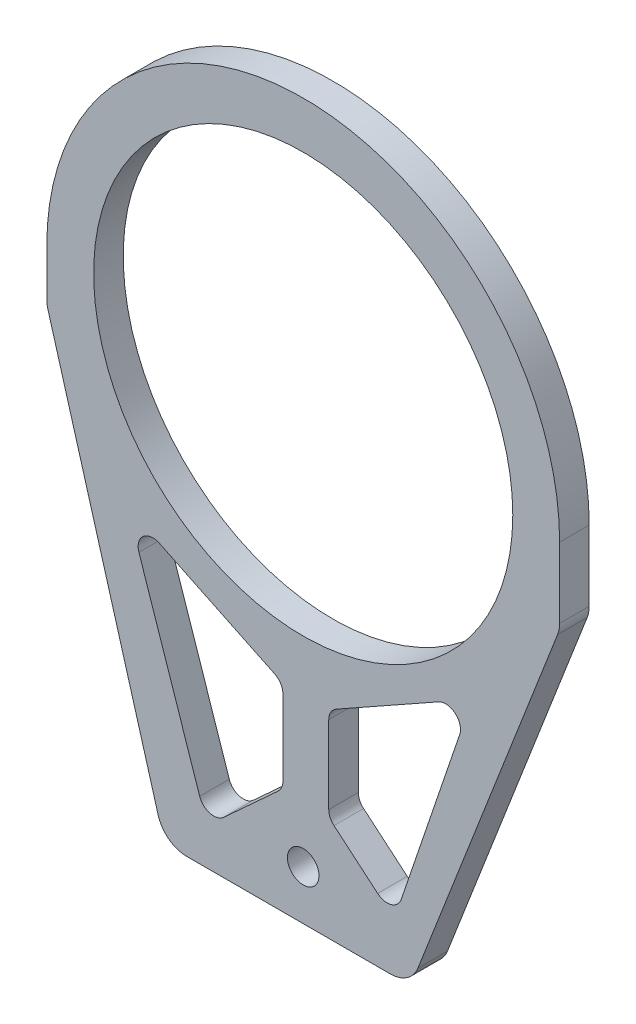
ISO-10303-21;
HEADER;
FILE_DESCRIPTION(('STEP AP214'),'2;1');
FILE_NAME('part.step','',(''),(''),'','','');
FILE_SCHEMA(('AUTOMOTIVE_DESIGN { 1 0 10303 214 1 1 1 1 }'));
ENDSEC;
DATA;
#1=APPLICATION_CONTEXT('core data for automotive mechanical design processes');
#2=APPLICATION_PROTOCOL_DEFINITION('international standard','automotive_design',2000,#1);
#3=PRODUCT_CONTEXT('',#1,'mechanical');
#4=PRODUCT('Part','Part','',(#3));
#5=PRODUCT_RELATED_PRODUCT_CATEGORY('part','',(#4));
#6=PRODUCT_DEFINITION_FORMATION('','',#4);
#7=PRODUCT_DEFINITION_CONTEXT('part definition',#1,'design');
#8=PRODUCT_DEFINITION('design','',#6,#7);
#9=PRODUCT_DEFINITION_SHAPE('','',#8);
#10=(LENGTH_UNIT() NAMED_UNIT(*) SI_UNIT(.MILLI.,.METRE.));
#11=(NAMED_UNIT(*) PLANE_ANGLE_UNIT() SI_UNIT($,.RADIAN.));
#12=(NAMED_UNIT(*) SI_UNIT($,.STERADIAN.) SOLID_ANGLE_UNIT());
#13=UNCERTAINTY_MEASURE_WITH_UNIT(LENGTH_MEASURE(1.E-05),#10,'distance_accuracy_value','');
#14=(GEOMETRIC_REPRESENTATION_CONTEXT(3) GLOBAL_UNCERTAINTY_ASSIGNED_CONTEXT((#13)) GLOBAL_UNIT_ASSIGNED_CONTEXT((#10,
#11,#12)) REPRESENTATION_CONTEXT('',''));
#15=CARTESIAN_POINT('',(0.,0.,0.));
#16=DIRECTION('',(0.,0.,1.));
#17=DIRECTION('',(1.,0.,0.));
#18=AXIS2_PLACEMENT_3D('',#15,#16,#17);
#19=CARTESIAN_POINT('',(0.,0.,3.));
#20=DIRECTION('',(0.,0.,-1.));
#21=DIRECTION('',(-1.,0.,0.));
#22=AXIS2_PLACEMENT_3D('',#19,#20,#21);
#23=PLANE('',#22);
#24=DIRECTION('',(0.737119663275112,0.675762237782776,0.));
#25=VECTOR('',#24,1.);
#26=CARTESIAN_POINT('',(-2.05818451952137,-35.6888801272743,3.));
#27=LINE('',#26,#25);
#28=CARTESIAN_POINT('',(-8.0592837787369,-41.1904512650538,3.));
#29=VERTEX_POINT('',#28);
#30=CARTESIAN_POINT('',(-2.54454116284721,-36.1347527176135,3.));
#31=VERTEX_POINT('',#30);
#32=EDGE_CURVE('E551',#29,#31,#27,.T.);
#33=ORIENTED_EDGE('',*,*,#32,.F.);
#34=CARTESIAN_POINT('',(-9.07292713541106,-40.0847717701411,3.));
#35=DIRECTION('',(0.,0.,-1.));
#36=DIRECTION('',(-1.,0.,0.));
#37=AXIS2_PLACEMENT_3D('',#34,#35,#36);
#38=CIRCLE('',#37,1.5);
#39=CARTESIAN_POINT('',(-10.4947627799199,-40.5626665284343,3.));
#40=VERTEX_POINT('',#39);
#41=EDGE_CURVE('E347',#29,#40,#38,.T.);
#42=ORIENTED_EDGE('',*,*,#41,.T.);
#43=DIRECTION('',(0.318596505528831,-0.947890429672553,0.));
#44=VECTOR('',#43,1.);
#45=CARTESIAN_POINT('',(-9.75977820547236,-42.7493974937328,3.));
#46=LINE('',#45,#44);
#47=CARTESIAN_POINT('',(-16.6601756481558,-22.2192893997986,3.));
#48=VERTEX_POINT('',#47);
#49=EDGE_CURVE('E547',#48,#40,#46,.T.);
#50=ORIENTED_EDGE('',*,*,#49,.F.);
#51=CARTESIAN_POINT('',(-15.238340003647,-21.7413946415053,3.));
#52=DIRECTION('',(0.,0.,-1.));
#53=DIRECTION('',(-1.,0.,0.));
#54=AXIS2_PLACEMENT_3D('',#51,#52,#53);
#55=CIRCLE('',#54,1.5);
#56=CARTESIAN_POINT('',(-14.5881310887193,-20.3896445288926,3.));
#57=VERTEX_POINT('',#56);
#58=EDGE_CURVE('E353',#48,#57,#55,.T.);
#59=ORIENTED_EDGE('',*,*,#58,.T.);
#60=DIRECTION('',(-0.901166741741838,0.43347260995177,0.));
#61=VECTOR('',#60,1.);
#62=CARTESIAN_POINT('',(-17.7933371365074,-18.847899847678,3.));
#63=LINE('',#62,#61);
#64=CARTESIAN_POINT('',(-2.90797560459372,-26.0079471668264,3.));
#65=VERTEX_POINT('',#64);
#66=EDGE_CURVE('E555',#65,#57,#63,.T.);
#67=ORIENTED_EDGE('',*,*,#66,.F.);
#68=CARTESIAN_POINT('',(-3.55818451952137,-27.3596972794391,3.));
#69=DIRECTION('',(0.,0.,-1.));
#70=DIRECTION('',(-1.,0.,0.));
#71=AXIS2_PLACEMENT_3D('',#68,#69,#70);
#72=CIRCLE('',#71,1.5);
#73=CARTESIAN_POINT('',(-2.05818451952138,-27.3596972794391,3.));
#74=VERTEX_POINT('',#73);
#75=EDGE_CURVE('E335',#65,#74,#72,.T.);
#76=ORIENTED_EDGE('',*,*,#75,.T.);
#77=DIRECTION('',(0.,1.,0.));
#78=VECTOR('',#77,1.);
#79=CARTESIAN_POINT('',(-2.05818451952138,-26.4167074355954,3.));
#80=LINE('',#79,#78);
#81=CARTESIAN_POINT('',(-2.05818451952137,-35.0290732227008,3.));
#82=VERTEX_POINT('',#81);
#83=EDGE_CURVE('E559',#82,#74,#80,.T.);
#84=ORIENTED_EDGE('',*,*,#83,.F.);
#85=CARTESIAN_POINT('',(-3.55818451952137,-35.0290732227008,3.));
#86=DIRECTION('',(0.,0.,-1.));
#87=DIRECTION('',(-1.,0.,0.));
#88=AXIS2_PLACEMENT_3D('',#85,#86,#87);
#89=CIRCLE('',#88,1.5);
#90=EDGE_CURVE('E341',#82,#31,#89,.T.);
#91=ORIENTED_EDGE('',*,*,#90,.T.);
#92=EDGE_LOOP('',(#33,#42,#50,#59,#67,#76,#84,#91));
#93=FACE_BOUND('',#92,.T.);
#94=DIRECTION('',(-0.871894325416386,-0.489694073179066,0.));
#95=VECTOR('',#94,1.);
#96=CARTESIAN_POINT('',(17.1294066463393,-18.2503624065267,3.));
#97=LINE('',#96,#95);
#98=CARTESIAN_POINT('',(13.7135891545581,-20.1688352443764,3.));
#99=VERTEX_POINT('',#98);
#100=CARTESIAN_POINT('',(3.35478780188734,-25.9867921684791,3.));
#101=VERTEX_POINT('',#100);
#102=EDGE_CURVE('E817',#99,#101,#97,.T.);
#103=ORIENTED_EDGE('',*,*,#102,.F.);
#104=CARTESIAN_POINT('',(14.4481302643267,-21.4766767325009,3.));
#105=DIRECTION('',(0.,0.,-1.));
#106=DIRECTION('',(-1.,0.,0.));
#107=AXIS2_PLACEMENT_3D('',#104,#105,#106);
#108=CIRCLE('',#107,1.5);
#109=CARTESIAN_POINT('',(15.8682893815563,-21.959530832359,3.));
#110=VERTEX_POINT('',#109);
#111=EDGE_CURVE('E329',#99,#110,#108,.T.);
#112=ORIENTED_EDGE('',*,*,#111,.T.);
#113=DIRECTION('',(0.321902733238703,0.946772744819713,0.));
#114=VECTOR('',#113,1.);
#115=CARTESIAN_POINT('',(9.22863381333781,-41.4879295624132,3.));
#116=LINE('',#115,#114);
#117=CARTESIAN_POINT('',(9.93676518601087,-39.4051902310219,3.));
#118=VERTEX_POINT('',#117);
#119=EDGE_CURVE('E572',#118,#110,#116,.T.);
#120=ORIENTED_EDGE('',*,*,#119,.F.);
#121=CARTESIAN_POINT('',(8.5166060687813,-38.9223361311639,3.));
#122=DIRECTION('',(0.,0.,-1.));
#123=DIRECTION('',(-1.,0.,0.));
#124=AXIS2_PLACEMENT_3D('',#121,#122,#123);
#125=CIRCLE('',#124,1.5);
#126=CARTESIAN_POINT('',(7.54841626011113,-40.0680274047569,3.));
#127=VERTEX_POINT('',#126);
#128=EDGE_CURVE('E311',#118,#127,#125,.T.);
#129=ORIENTED_EDGE('',*,*,#128,.T.);
#130=DIRECTION('',(0.763794182395353,-0.64545987244678,0.));
#131=VECTOR('',#130,1.);
#132=CARTESIAN_POINT('',(2.58932891165593,-35.8772493638088,3.));
#133=LINE('',#132,#131);
#134=CARTESIAN_POINT('',(3.12113910298577,-36.3266664269045,3.));
#135=VERTEX_POINT('',#134);
#136=EDGE_CURVE('E818',#135,#127,#133,.T.);
#137=ORIENTED_EDGE('',*,*,#136,.F.);
#138=CARTESIAN_POINT('',(4.08932891165594,-35.1809751533114,3.));
#139=DIRECTION('',(0.,0.,-1.));
#140=DIRECTION('',(-1.,0.,0.));
#141=AXIS2_PLACEMENT_3D('',#138,#139,#140);
#142=CIRCLE('',#141,1.5);
#143=CARTESIAN_POINT('',(2.58932891165593,-35.1809751533114,3.));
#144=VERTEX_POINT('',#143);
#145=EDGE_CURVE('E317',#135,#144,#142,.T.);
#146=ORIENTED_EDGE('',*,*,#145,.T.);
#147=DIRECTION('',(0.,-1.,0.));
#148=VECTOR('',#147,1.);
#149=CARTESIAN_POINT('',(2.58932891165593,-26.4167074355954,3.));
#150=LINE('',#149,#148);
#151=CARTESIAN_POINT('',(2.58932891165593,-27.2946336566037,3.));
#152=VERTEX_POINT('',#151);
#153=EDGE_CURVE('E811',#152,#144,#150,.T.);
#154=ORIENTED_EDGE('',*,*,#153,.F.);
#155=CARTESIAN_POINT('',(4.08932891165593,-27.2946336566037,3.));
#156=DIRECTION('',(0.,0.,-1.));
#157=DIRECTION('',(-1.,0.,0.));
#158=AXIS2_PLACEMENT_3D('',#155,#156,#157);
#159=CIRCLE('',#158,1.5);
#160=EDGE_CURVE('E323',#152,#101,#159,.T.);
#161=ORIENTED_EDGE('',*,*,#160,.T.);
#162=EDGE_LOOP('',(#103,#112,#120,#129,#137,#146,#154,#161));
#163=FACE_BOUND('',#162,.T.);
#164=CARTESIAN_POINT('',(0.,-41.5,3.));
#165=DIRECTION('',(0.,0.,1.));
#166=DIRECTION('',(1.,0.,0.));
#167=AXIS2_PLACEMENT_3D('',#164,#165,#166);
#168=CIRCLE('',#167,1.6);
#169=CARTESIAN_POINT('',(1.6,-41.5,3.));
#170=VERTEX_POINT('',#169);
#171=EDGE_CURVE('E445',#170,#170,#168,.T.);
#172=ORIENTED_EDGE('',*,*,#171,.F.);
#173=EDGE_LOOP('',(#172));
#174=FACE_BOUND('',#173,.T.);
#175=DIRECTION('',(-0.362868941891469,-0.931840185337897,0.));
#176=VECTOR('',#175,1.);
#177=CARTESIAN_POINT('',(26.,-7.69386761285248,3.));
#178=LINE('',#177,#176);
#179=CARTESIAN_POINT('',(25.7955205560137,-8.21896673538632,3.));
#180=VERTEX_POINT('',#179);
#181=CARTESIAN_POINT('',(11.6327778194458,-44.5886068256744,3.));
#182=VERTEX_POINT('',#181);
#183=EDGE_CURVE('E441',#180,#182,#178,.T.);
#184=ORIENTED_EDGE('',*,*,#183,.F.);
#185=CARTESIAN_POINT('',(23.,-7.13035990971192,3.));
#186=DIRECTION('',(0.,0.,-1.));
#187=DIRECTION('',(-1.,0.,0.));
#188=AXIS2_PLACEMENT_3D('',#185,#186,#187);
#189=CIRCLE('',#188,3.);
#190=CARTESIAN_POINT('',(26.,-7.13035990971193,3.));
#191=VERTEX_POINT('',#190);
#192=EDGE_CURVE('E375',#180,#191,#189,.F.);
#193=ORIENTED_EDGE('',*,*,#192,.T.);
#194=DIRECTION('',(0.,1.,0.));
#195=VECTOR('',#194,1.);
#196=CARTESIAN_POINT('',(26.,-46.5,3.));
#197=LINE('',#196,#195);
#198=CARTESIAN_POINT('',(26.,0.,3.));
#199=VERTEX_POINT('',#198);
#200=EDGE_CURVE('E238',#191,#199,#197,.T.);
#201=ORIENTED_EDGE('',*,*,#200,.T.);
#202=CARTESIAN_POINT('',(0.,0.,3.));
#203=DIRECTION('',(0.,0.,1.));
#204=DIRECTION('',(-1.,0.,0.));
#205=AXIS2_PLACEMENT_3D('',#202,#203,#204);
#206=CIRCLE('',#205,26.);
#207=CARTESIAN_POINT('',(-26.,0.,3.));
#208=VERTEX_POINT('',#207);
#209=EDGE_CURVE('E232',#199,#208,#206,.T.);
#210=ORIENTED_EDGE('',*,*,#209,.T.);
#211=DIRECTION('',(0.,-1.,0.));
#212=VECTOR('',#211,1.);
#213=CARTESIAN_POINT('',(-26.,0.,3.));
#214=LINE('',#213,#212);
#215=CARTESIAN_POINT('',(-26.,-4.68104845744961,3.));
#216=VERTEX_POINT('',#215);
#217=EDGE_CURVE('E221',#208,#216,#214,.T.);
#218=ORIENTED_EDGE('',*,*,#217,.T.);
#219=CARTESIAN_POINT('',(-23.,-4.68104845744961,3.));
#220=DIRECTION('',(0.,0.,-1.));
#221=DIRECTION('',(-1.,0.,0.));
#222=AXIS2_PLACEMENT_3D('',#219,#220,#221);
#223=CIRCLE('',#222,3.);
#224=CARTESIAN_POINT('',(-25.8827733309842,-5.51148082806508,3.));
#225=VERTEX_POINT('',#224);
#226=EDGE_CURVE('E372',#216,#225,#223,.F.);
#227=ORIENTED_EDGE('',*,*,#226,.T.);
#228=DIRECTION('',(-0.276810790205157,0.960924443661413,0.));
#229=VECTOR('',#228,1.);
#230=CARTESIAN_POINT('',(-26.,-5.10453870119653,3.));
#231=LINE('',#230,#229);
#232=CARTESIAN_POINT('',(-14.7003076102815,-44.3304323706155,3.));
#233=VERTEX_POINT('',#232);
#234=EDGE_CURVE('E436',#233,#225,#231,.T.);
#235=ORIENTED_EDGE('',*,*,#234,.F.);
#236=CARTESIAN_POINT('',(-11.8175342792973,-43.5,3.));
#237=DIRECTION('',(0.,0.,-1.));
#238=DIRECTION('',(-1.,0.,0.));
#239=AXIS2_PLACEMENT_3D('',#236,#237,#238);
#240=CIRCLE('',#239,3.);
#241=CARTESIAN_POINT('',(-11.8175342792973,-46.5,3.));
#242=VERTEX_POINT('',#241);
#243=EDGE_CURVE('E369',#233,#242,#240,.F.);
#244=ORIENTED_EDGE('',*,*,#243,.T.);
#245=DIRECTION('',(1.,0.,0.));
#246=VECTOR('',#245,1.);
#247=CARTESIAN_POINT('',(-26.,-46.5,3.));
#248=LINE('',#247,#246);
#249=CARTESIAN_POINT('',(8.83725726343207,-46.5,3.));
#250=VERTEX_POINT('',#249);
#251=EDGE_CURVE('E231',#242,#250,#248,.T.);
#252=ORIENTED_EDGE('',*,*,#251,.T.);
#253=CARTESIAN_POINT('',(8.83725726343207,-43.5,3.));
#254=DIRECTION('',(0.,0.,-1.));
#255=DIRECTION('',(-1.,0.,0.));
#256=AXIS2_PLACEMENT_3D('',#253,#254,#255);
#257=CIRCLE('',#256,3.);
#258=EDGE_CURVE('E366',#250,#182,#257,.F.);
#259=ORIENTED_EDGE('',*,*,#258,.T.);
#260=EDGE_LOOP('',(#184,#193,#201,#210,#218,#227,#235,#244,#252,#259));
#261=FACE_BOUND('',#260,.T.);
#262=CARTESIAN_POINT('',(0.,0.,3.));
#263=DIRECTION('',(0.,0.,1.));
#264=DIRECTION('',(1.,0.,0.));
#265=AXIS2_PLACEMENT_3D('',#262,#263,#264);
#266=CIRCLE('',#265,21.25);
#267=CARTESIAN_POINT('',(21.25,0.,3.));
#268=VERTEX_POINT('',#267);
#269=EDGE_CURVE('E422',#268,#268,#266,.T.);
#270=ORIENTED_EDGE('',*,*,#269,.F.);
#271=EDGE_LOOP('',(#270));
#272=FACE_BOUND('',#271,.T.);
#273=ADVANCED_FACE('F45',(#93,#163,#174,#261,#272),#23,.F.);
#274=CARTESIAN_POINT('',(0.,0.,0.));
#275=DIRECTION('',(0.,0.,-1.));
#276=DIRECTION('',(-1.,0.,0.));
#277=AXIS2_PLACEMENT_3D('',#274,#275,#276);
#278=PLANE('',#277);
#279=DIRECTION('',(0.,1.,0.));
#280=VECTOR('',#279,1.);
#281=CARTESIAN_POINT('',(26.,-46.5,0.));
#282=LINE('',#281,#280);
#283=CARTESIAN_POINT('',(26.,-7.13035990971193,0.));
#284=VERTEX_POINT('',#283);
#285=CARTESIAN_POINT('',(26.,0.,0.));
#286=VERTEX_POINT('',#285);
#287=EDGE_CURVE('E243',#284,#286,#282,.T.);
#288=ORIENTED_EDGE('',*,*,#287,.F.);
#289=CARTESIAN_POINT('',(23.,-7.13035990971192,0.));
#290=DIRECTION('',(0.,0.,-1.));
#291=DIRECTION('',(-1.,0.,0.));
#292=AXIS2_PLACEMENT_3D('',#289,#290,#291);
#293=CIRCLE('',#292,3.);
#294=CARTESIAN_POINT('',(25.7955205560137,-8.21896673538632,0.));
#295=VERTEX_POINT('',#294);
#296=EDGE_CURVE('E389',#284,#295,#293,.T.);
#297=ORIENTED_EDGE('',*,*,#296,.T.);
#298=DIRECTION('',(-0.362868941891469,-0.931840185337897,0.));
#299=VECTOR('',#298,1.);
#300=CARTESIAN_POINT('',(26.,-7.69386761285248,0.));
#301=LINE('',#300,#299);
#302=CARTESIAN_POINT('',(11.6327778194458,-44.5886068256744,0.));
#303=VERTEX_POINT('',#302);
#304=EDGE_CURVE('E447',#295,#303,#301,.T.);
#305=ORIENTED_EDGE('',*,*,#304,.T.);
#306=CARTESIAN_POINT('',(8.83725726343207,-43.5,0.));
#307=DIRECTION('',(0.,0.,-1.));
#308=DIRECTION('',(-1.,0.,0.));
#309=AXIS2_PLACEMENT_3D('',#306,#307,#308);
#310=CIRCLE('',#309,3.);
#311=CARTESIAN_POINT('',(8.83725726343207,-46.5,0.));
#312=VERTEX_POINT('',#311);
#313=EDGE_CURVE('E381',#303,#312,#310,.T.);
#314=ORIENTED_EDGE('',*,*,#313,.T.);
#315=DIRECTION('',(1.,0.,0.));
#316=VECTOR('',#315,1.);
#317=CARTESIAN_POINT('',(-26.,-46.5,0.));
#318=LINE('',#317,#316);
#319=CARTESIAN_POINT('',(-11.8175342792973,-46.5,0.));
#320=VERTEX_POINT('',#319);
#321=EDGE_CURVE('E409',#320,#312,#318,.T.);
#322=ORIENTED_EDGE('',*,*,#321,.F.);
#323=CARTESIAN_POINT('',(-11.8175342792973,-43.5,0.));
#324=DIRECTION('',(0.,0.,-1.));
#325=DIRECTION('',(-1.,0.,0.));
#326=AXIS2_PLACEMENT_3D('',#323,#324,#325);
#327=CIRCLE('',#326,3.);
#328=CARTESIAN_POINT('',(-14.7003076102815,-44.3304323706155,0.));
#329=VERTEX_POINT('',#328);
#330=EDGE_CURVE('E384',#320,#329,#327,.T.);
#331=ORIENTED_EDGE('',*,*,#330,.T.);
#332=DIRECTION('',(-0.276810790205157,0.960924443661413,0.));
#333=VECTOR('',#332,1.);
#334=CARTESIAN_POINT('',(-26.,-5.10453870119653,0.));
#335=LINE('',#334,#333);
#336=CARTESIAN_POINT('',(-25.8827733309842,-5.51148082806508,0.));
#337=VERTEX_POINT('',#336);
#338=EDGE_CURVE('E440',#329,#337,#335,.T.);
#339=ORIENTED_EDGE('',*,*,#338,.T.);
#340=CARTESIAN_POINT('',(-23.,-4.68104845744961,0.));
#341=DIRECTION('',(0.,0.,-1.));
#342=DIRECTION('',(-1.,0.,0.));
#343=AXIS2_PLACEMENT_3D('',#340,#341,#342);
#344=CIRCLE('',#343,3.);
#345=CARTESIAN_POINT('',(-26.,-4.68104845744961,0.));
#346=VERTEX_POINT('',#345);
#347=EDGE_CURVE('E61',#337,#346,#344,.T.);
#348=ORIENTED_EDGE('',*,*,#347,.T.);
#349=DIRECTION('',(0.,-1.,0.));
#350=VECTOR('',#349,1.);
#351=CARTESIAN_POINT('',(-26.,0.,0.));
#352=LINE('',#351,#350);
#353=CARTESIAN_POINT('',(-26.,0.,0.));
#354=VERTEX_POINT('',#353);
#355=EDGE_CURVE('E421',#354,#346,#352,.T.);
#356=ORIENTED_EDGE('',*,*,#355,.F.);
#357=CARTESIAN_POINT('',(0.,0.,0.));
#358=DIRECTION('',(0.,0.,1.));
#359=DIRECTION('',(-1.,0.,0.));
#360=AXIS2_PLACEMENT_3D('',#357,#358,#359);
#361=CIRCLE('',#360,26.);
#362=EDGE_CURVE('E247',#286,#354,#361,.T.);
#363=ORIENTED_EDGE('',*,*,#362,.F.);
#364=EDGE_LOOP('',(#288,#297,#305,#314,#322,#331,#339,#348,#356,#363));
#365=FACE_BOUND('',#364,.T.);
#366=DIRECTION('',(-0.901166741741838,0.43347260995177,0.));
#367=VECTOR('',#366,1.);
#368=CARTESIAN_POINT('',(-17.7933371365074,-18.847899847678,0.));
#369=LINE('',#368,#367);
#370=CARTESIAN_POINT('',(-2.90797560459372,-26.0079471668264,0.));
#371=VERTEX_POINT('',#370);
#372=CARTESIAN_POINT('',(-14.5881310887193,-20.3896445288926,0.));
#373=VERTEX_POINT('',#372);
#374=EDGE_CURVE('E567',#371,#373,#369,.T.);
#375=ORIENTED_EDGE('',*,*,#374,.T.);
#376=CARTESIAN_POINT('',(-15.238340003647,-21.7413946415053,0.));
#377=DIRECTION('',(0.,0.,-1.));
#378=DIRECTION('',(-1.,0.,0.));
#379=AXIS2_PLACEMENT_3D('',#376,#377,#378);
#380=CIRCLE('',#379,1.5);
#381=CARTESIAN_POINT('',(-16.6601756481558,-22.2192893997986,0.));
#382=VERTEX_POINT('',#381);
#383=EDGE_CURVE('E356',#373,#382,#380,.F.);
#384=ORIENTED_EDGE('',*,*,#383,.T.);
#385=DIRECTION('',(0.318596505528831,-0.947890429672553,0.));
#386=VECTOR('',#385,1.);
#387=CARTESIAN_POINT('',(-9.75977820547236,-42.7493974937328,0.));
#388=LINE('',#387,#386);
#389=CARTESIAN_POINT('',(-10.4947627799199,-40.5626665284343,0.));
#390=VERTEX_POINT('',#389);
#391=EDGE_CURVE('E560',#382,#390,#388,.T.);
#392=ORIENTED_EDGE('',*,*,#391,.T.);
#393=CARTESIAN_POINT('',(-9.07292713541106,-40.0847717701411,0.));
#394=DIRECTION('',(0.,0.,-1.));
#395=DIRECTION('',(-1.,0.,0.));
#396=AXIS2_PLACEMENT_3D('',#393,#394,#395);
#397=CIRCLE('',#396,1.5);
#398=CARTESIAN_POINT('',(-8.0592837787369,-41.1904512650538,0.));
#399=VERTEX_POINT('',#398);
#400=EDGE_CURVE('E350',#390,#399,#397,.F.);
#401=ORIENTED_EDGE('',*,*,#400,.T.);
#402=DIRECTION('',(0.737119663275112,0.675762237782776,0.));
#403=VECTOR('',#402,1.);
#404=CARTESIAN_POINT('',(-2.05818451952137,-35.6888801272743,0.));
#405=LINE('',#404,#403);
#406=CARTESIAN_POINT('',(-2.54454116284721,-36.1347527176135,0.));
#407=VERTEX_POINT('',#406);
#408=EDGE_CURVE('E576',#399,#407,#405,.T.);
#409=ORIENTED_EDGE('',*,*,#408,.T.);
#410=CARTESIAN_POINT('',(-3.55818451952137,-35.0290732227008,0.));
#411=DIRECTION('',(0.,0.,-1.));
#412=DIRECTION('',(-1.,0.,0.));
#413=AXIS2_PLACEMENT_3D('',#410,#411,#412);
#414=CIRCLE('',#413,1.5);
#415=CARTESIAN_POINT('',(-2.05818451952137,-35.0290732227008,0.));
#416=VERTEX_POINT('',#415);
#417=EDGE_CURVE('E344',#407,#416,#414,.F.);
#418=ORIENTED_EDGE('',*,*,#417,.T.);
#419=DIRECTION('',(0.,1.,0.));
#420=VECTOR('',#419,1.);
#421=CARTESIAN_POINT('',(-2.05818451952138,-26.4167074355954,0.));
#422=LINE('',#421,#420);
#423=CARTESIAN_POINT('',(-2.05818451952138,-27.3596972794391,0.));
#424=VERTEX_POINT('',#423);
#425=EDGE_CURVE('E571',#416,#424,#422,.T.);
#426=ORIENTED_EDGE('',*,*,#425,.T.);
#427=CARTESIAN_POINT('',(-3.55818451952137,-27.3596972794391,0.));
#428=DIRECTION('',(0.,0.,-1.));
#429=DIRECTION('',(-1.,0.,0.));
#430=AXIS2_PLACEMENT_3D('',#427,#428,#429);
#431=CIRCLE('',#430,1.5);
#432=EDGE_CURVE('E338',#424,#371,#431,.F.);
#433=ORIENTED_EDGE('',*,*,#432,.T.);
#434=EDGE_LOOP('',(#375,#384,#392,#401,#409,#418,#426,#433));
#435=FACE_BOUND('',#434,.T.);
#436=DIRECTION('',(0.763794182395353,-0.64545987244678,0.));
#437=VECTOR('',#436,1.);
#438=CARTESIAN_POINT('',(2.58932891165593,-35.8772493638088,0.));
#439=LINE('',#438,#437);
#440=CARTESIAN_POINT('',(3.12113910298577,-36.3266664269045,0.));
#441=VERTEX_POINT('',#440);
#442=CARTESIAN_POINT('',(7.54841626011113,-40.0680274047569,0.));
#443=VERTEX_POINT('',#442);
#444=EDGE_CURVE('E825',#441,#443,#439,.T.);
#445=ORIENTED_EDGE('',*,*,#444,.T.);
#446=CARTESIAN_POINT('',(8.5166060687813,-38.9223361311639,0.));
#447=DIRECTION('',(0.,0.,-1.));
#448=DIRECTION('',(-1.,0.,0.));
#449=AXIS2_PLACEMENT_3D('',#446,#447,#448);
#450=CIRCLE('',#449,1.5);
#451=CARTESIAN_POINT('',(9.93676518601087,-39.4051902310219,0.));
#452=VERTEX_POINT('',#451);
#453=EDGE_CURVE('E314',#443,#452,#450,.F.);
#454=ORIENTED_EDGE('',*,*,#453,.T.);
#455=DIRECTION('',(0.321902733238703,0.946772744819713,0.));
#456=VECTOR('',#455,1.);
#457=CARTESIAN_POINT('',(9.22863381333781,-41.4879295624132,0.));
#458=LINE('',#457,#456);
#459=CARTESIAN_POINT('',(15.8682893815563,-21.959530832359,0.));
#460=VERTEX_POINT('',#459);
#461=EDGE_CURVE('E841',#452,#460,#458,.T.);
#462=ORIENTED_EDGE('',*,*,#461,.T.);
#463=CARTESIAN_POINT('',(14.4481302643267,-21.4766767325009,0.));
#464=DIRECTION('',(0.,0.,-1.));
#465=DIRECTION('',(-1.,0.,0.));
#466=AXIS2_PLACEMENT_3D('',#463,#464,#465);
#467=CIRCLE('',#466,1.5);
#468=CARTESIAN_POINT('',(13.7135891545581,-20.1688352443764,0.));
#469=VERTEX_POINT('',#468);
#470=EDGE_CURVE('E332',#460,#469,#467,.F.);
#471=ORIENTED_EDGE('',*,*,#470,.T.);
#472=DIRECTION('',(-0.871894325416386,-0.489694073179066,0.));
#473=VECTOR('',#472,1.);
#474=CARTESIAN_POINT('',(17.1294066463393,-18.2503624065267,0.));
#475=LINE('',#474,#473);
#476=CARTESIAN_POINT('',(3.35478780188734,-25.9867921684791,0.));
#477=VERTEX_POINT('',#476);
#478=EDGE_CURVE('E834',#469,#477,#475,.T.);
#479=ORIENTED_EDGE('',*,*,#478,.T.);
#480=CARTESIAN_POINT('',(4.08932891165593,-27.2946336566037,0.));
#481=DIRECTION('',(0.,0.,-1.));
#482=DIRECTION('',(-1.,0.,0.));
#483=AXIS2_PLACEMENT_3D('',#480,#481,#482);
#484=CIRCLE('',#483,1.5);
#485=CARTESIAN_POINT('',(2.58932891165593,-27.2946336566037,0.));
#486=VERTEX_POINT('',#485);
#487=EDGE_CURVE('E326',#477,#486,#484,.F.);
#488=ORIENTED_EDGE('',*,*,#487,.T.);
#489=DIRECTION('',(0.,-1.,0.));
#490=VECTOR('',#489,1.);
#491=CARTESIAN_POINT('',(2.58932891165593,-26.4167074355954,0.));
#492=LINE('',#491,#490);
#493=CARTESIAN_POINT('',(2.58932891165593,-35.1809751533114,0.));
#494=VERTEX_POINT('',#493);
#495=EDGE_CURVE('E827',#486,#494,#492,.T.);
#496=ORIENTED_EDGE('',*,*,#495,.T.);
#497=CARTESIAN_POINT('',(4.08932891165594,-35.1809751533114,0.));
#498=DIRECTION('',(0.,0.,-1.));
#499=DIRECTION('',(-1.,0.,0.));
#500=AXIS2_PLACEMENT_3D('',#497,#498,#499);
#501=CIRCLE('',#500,1.5);
#502=EDGE_CURVE('E320',#494,#441,#501,.F.);
#503=ORIENTED_EDGE('',*,*,#502,.T.);
#504=EDGE_LOOP('',(#445,#454,#462,#471,#479,#488,#496,#503));
#505=FACE_BOUND('',#504,.T.);
#506=CARTESIAN_POINT('',(0.,-41.5,0.));
#507=DIRECTION('',(0.,0.,1.));
#508=DIRECTION('',(1.,0.,0.));
#509=AXIS2_PLACEMENT_3D('',#506,#507,#508);
#510=CIRCLE('',#509,1.6);
#511=CARTESIAN_POINT('',(1.6,-41.5,0.));
#512=VERTEX_POINT('',#511);
#513=EDGE_CURVE('E451',#512,#512,#510,.T.);
#514=ORIENTED_EDGE('',*,*,#513,.T.);
#515=EDGE_LOOP('',(#514));
#516=FACE_BOUND('',#515,.T.);
#517=CARTESIAN_POINT('',(0.,0.,0.));
#518=DIRECTION('',(0.,0.,1.));
#519=DIRECTION('',(1.,0.,0.));
#520=AXIS2_PLACEMENT_3D('',#517,#518,#519);
#521=CIRCLE('',#520,21.25);
#522=CARTESIAN_POINT('',(21.25,0.,0.));
#523=VERTEX_POINT('',#522);
#524=EDGE_CURVE('E455',#523,#523,#521,.T.);
#525=ORIENTED_EDGE('',*,*,#524,.T.);
#526=EDGE_LOOP('',(#525));
#527=FACE_BOUND('',#526,.T.);
#528=ADVANCED_FACE('F432',(#365,#435,#505,#516,#527),#278,.T.);
#529=CARTESIAN_POINT('',(0.,0.,3.));
#530=DIRECTION('',(0.,0.,-1.));
#531=DIRECTION('',(-1.,0.,0.));
#532=AXIS2_PLACEMENT_3D('',#529,#530,#531);
#533=CYLINDRICAL_SURFACE('',#532,26.);
#534=ORIENTED_EDGE('',*,*,#362,.T.);
#535=DIRECTION('',(0.,0.,-1.));
#536=VECTOR('',#535,1.);
#537=CARTESIAN_POINT('',(-26.,0.,3.));
#538=LINE('',#537,#536);
#539=EDGE_CURVE('E225',#208,#354,#538,.T.);
#540=ORIENTED_EDGE('',*,*,#539,.F.);
#541=ORIENTED_EDGE('',*,*,#209,.F.);
#542=DIRECTION('',(0.,0.,-1.));
#543=VECTOR('',#542,1.);
#544=CARTESIAN_POINT('',(26.,0.,3.));
#545=LINE('',#544,#543);
#546=EDGE_CURVE('E250',#199,#286,#545,.T.);
#547=ORIENTED_EDGE('',*,*,#546,.T.);
#548=EDGE_LOOP('',(#534,#540,#541,#547));
#549=FACE_BOUND('',#548,.T.);
#550=ADVANCED_FACE('F245',(#549),#533,.T.);
#551=CARTESIAN_POINT('',(-26.,0.,3.));
#552=DIRECTION('',(1.,0.,0.));
#553=DIRECTION('',(0.,1.,0.));
#554=AXIS2_PLACEMENT_3D('',#551,#552,#553);
#555=PLANE('',#554);
#556=ORIENTED_EDGE('',*,*,#355,.T.);
#557=DIRECTION('',(0.,0.,1.));
#558=VECTOR('',#557,1.);
#559=CARTESIAN_POINT('',(-26.,-4.68104845744961,3.));
#560=LINE('',#559,#558);
#561=EDGE_CURVE('E228',#346,#216,#560,.T.);
#562=ORIENTED_EDGE('',*,*,#561,.T.);
#563=ORIENTED_EDGE('',*,*,#217,.F.);
#564=ORIENTED_EDGE('',*,*,#539,.T.);
#565=EDGE_LOOP('',(#556,#562,#563,#564));
#566=FACE_BOUND('',#565,.T.);
#567=ADVANCED_FACE('F223',(#566),#555,.F.);
#568=CARTESIAN_POINT('',(-26.,-46.5,3.));
#569=DIRECTION('',(0.,1.,0.));
#570=DIRECTION('',(0.,0.,1.));
#571=AXIS2_PLACEMENT_3D('',#568,#569,#570);
#572=PLANE('',#571);
#573=ORIENTED_EDGE('',*,*,#251,.F.);
#574=DIRECTION('',(0.,0.,1.));
#575=VECTOR('',#574,1.);
#576=CARTESIAN_POINT('',(-11.8175342792973,-46.5,3.));
#577=LINE('',#576,#575);
#578=EDGE_CURVE('E11',#242,#320,#577,.F.);
#579=ORIENTED_EDGE('',*,*,#578,.T.);
#580=ORIENTED_EDGE('',*,*,#321,.T.);
#581=DIRECTION('',(0.,0.,1.));
#582=VECTOR('',#581,1.);
#583=CARTESIAN_POINT('',(8.83725726343207,-46.5,3.));
#584=LINE('',#583,#582);
#585=EDGE_CURVE('E54',#312,#250,#584,.T.);
#586=ORIENTED_EDGE('',*,*,#585,.T.);
#587=EDGE_LOOP('',(#573,#579,#580,#586));
#588=FACE_BOUND('',#587,.T.);
#589=ADVANCED_FACE('F406',(#588),#572,.F.);
#590=CARTESIAN_POINT('',(26.,-46.5,3.));
#591=DIRECTION('',(-1.,0.,0.));
#592=DIRECTION('',(0.,-1.,0.));
#593=AXIS2_PLACEMENT_3D('',#590,#591,#592);
#594=PLANE('',#593);
#595=ORIENTED_EDGE('',*,*,#200,.F.);
#596=DIRECTION('',(0.,0.,1.));
#597=VECTOR('',#596,1.);
#598=CARTESIAN_POINT('',(26.,-7.13035990971192,3.));
#599=LINE('',#598,#597);
#600=EDGE_CURVE('E378',#191,#284,#599,.F.);
#601=ORIENTED_EDGE('',*,*,#600,.T.);
#602=ORIENTED_EDGE('',*,*,#287,.T.);
#603=ORIENTED_EDGE('',*,*,#546,.F.);
#604=EDGE_LOOP('',(#595,#601,#602,#603));
#605=FACE_BOUND('',#604,.T.);
#606=ADVANCED_FACE('F429',(#605),#594,.F.);
#607=CARTESIAN_POINT('',(0.,0.,3.));
#608=DIRECTION('',(0.,0.,-1.));
#609=DIRECTION('',(-1.,0.,0.));
#610=AXIS2_PLACEMENT_3D('',#607,#608,#609);
#611=CYLINDRICAL_SURFACE('',#610,21.25);
#612=ORIENTED_EDGE('',*,*,#269,.T.);
#613=EDGE_LOOP('',(#612));
#614=FACE_BOUND('',#613,.T.);
#615=ORIENTED_EDGE('',*,*,#524,.F.);
#616=EDGE_LOOP('',(#615));
#617=FACE_BOUND('',#616,.T.);
#618=ADVANCED_FACE('F467',(#614,#617),#611,.F.);
#619=CARTESIAN_POINT('',(0.,-41.5,0.));
#620=DIRECTION('',(0.,0.,1.));
#621=DIRECTION('',(1.,0.,0.));
#622=AXIS2_PLACEMENT_3D('',#619,#620,#621);
#623=CYLINDRICAL_SURFACE('',#622,1.6);
#624=ORIENTED_EDGE('',*,*,#513,.F.);
#625=EDGE_LOOP('',(#624));
#626=FACE_BOUND('',#625,.T.);
#627=ORIENTED_EDGE('',*,*,#171,.T.);
#628=EDGE_LOOP('',(#627));
#629=FACE_BOUND('',#628,.T.);
#630=ADVANCED_FACE('F469',(#626,#629),#623,.F.);
#631=CARTESIAN_POINT('',(26.,-7.69386761285248,0.));
#632=DIRECTION('',(-0.931840185337896,0.362868941891469,0.));
#633=DIRECTION('',(-0.362868941891469,-0.931840185337897,0.));
#634=AXIS2_PLACEMENT_3D('',#631,#632,#633);
#635=PLANE('',#634);
#636=ORIENTED_EDGE('',*,*,#304,.F.);
#637=DIRECTION('',(0.,0.,1.));
#638=VECTOR('',#637,1.);
#639=CARTESIAN_POINT('',(25.7955205560137,-8.21896673538632,0.));
#640=LINE('',#639,#638);
#641=EDGE_CURVE('E362',#295,#180,#640,.T.);
#642=ORIENTED_EDGE('',*,*,#641,.T.);
#643=ORIENTED_EDGE('',*,*,#183,.T.);
#644=DIRECTION('',(0.,0.,1.));
#645=VECTOR('',#644,1.);
#646=CARTESIAN_POINT('',(11.6327778194458,-44.5886068256744,0.));
#647=LINE('',#646,#645);
#648=EDGE_CURVE('E359',#182,#303,#647,.F.);
#649=ORIENTED_EDGE('',*,*,#648,.T.);
#650=EDGE_LOOP('',(#636,#642,#643,#649));
#651=FACE_BOUND('',#650,.T.);
#652=ADVANCED_FACE('F476',(#651),#635,.F.);
#653=CARTESIAN_POINT('',(-26.,-5.10453870119653,0.));
#654=DIRECTION('',(0.960924443661413,0.276810790205157,0.));
#655=DIRECTION('',(-0.276810790205157,0.960924443661413,0.));
#656=AXIS2_PLACEMENT_3D('',#653,#654,#655);
#657=PLANE('',#656);
#658=ORIENTED_EDGE('',*,*,#234,.T.);
#659=DIRECTION('',(0.,0.,1.));
#660=VECTOR('',#659,1.);
#661=CARTESIAN_POINT('',(-25.8827733309842,-5.51148082806508,0.));
#662=LINE('',#661,#660);
#663=EDGE_CURVE('E69',#225,#337,#662,.F.);
#664=ORIENTED_EDGE('',*,*,#663,.T.);
#665=ORIENTED_EDGE('',*,*,#338,.F.);
#666=DIRECTION('',(0.,0.,1.));
#667=VECTOR('',#666,1.);
#668=CARTESIAN_POINT('',(-14.7003076102815,-44.3304323706155,0.));
#669=LINE('',#668,#667);
#670=EDGE_CURVE('E394',#329,#233,#669,.T.);
#671=ORIENTED_EDGE('',*,*,#670,.T.);
#672=EDGE_LOOP('',(#658,#664,#665,#671));
#673=FACE_BOUND('',#672,.T.);
#674=ADVANCED_FACE('F437',(#673),#657,.F.);
#675=CARTESIAN_POINT('',(9.22863381333781,-41.4879295624132,0.));
#676=DIRECTION('',(0.946772744819713,-0.321902733238703,0.));
#677=DIRECTION('',(0.321902733238703,0.946772744819713,0.));
#678=AXIS2_PLACEMENT_3D('',#675,#676,#677);
#679=PLANE('',#678);
#680=ORIENTED_EDGE('',*,*,#461,.F.);
#681=DIRECTION('',(0.,0.,1.));
#682=VECTOR('',#681,1.);
#683=CARTESIAN_POINT('',(9.93676518601087,-39.4051902310219,3.));
#684=LINE('',#683,#682);
#685=EDGE_CURVE('E254',#452,#118,#684,.T.);
#686=ORIENTED_EDGE('',*,*,#685,.T.);
#687=ORIENTED_EDGE('',*,*,#119,.T.);
#688=DIRECTION('',(0.,0.,1.));
#689=VECTOR('',#688,1.);
#690=CARTESIAN_POINT('',(15.8682893815563,-21.959530832359,0.));
#691=LINE('',#690,#689);
#692=EDGE_CURVE('E249',#110,#460,#691,.F.);
#693=ORIENTED_EDGE('',*,*,#692,.T.);
#694=EDGE_LOOP('',(#680,#686,#687,#693));
#695=FACE_BOUND('',#694,.T.);
#696=ADVANCED_FACE('F627',(#695),#679,.F.);
#697=CARTESIAN_POINT('',(2.58932891165593,-35.8772493638088,0.));
#698=DIRECTION('',(-0.64545987244678,-0.763794182395354,0.));
#699=DIRECTION('',(0.763794182395354,-0.64545987244678,0.));
#700=AXIS2_PLACEMENT_3D('',#697,#698,#699);
#701=PLANE('',#700);
#702=ORIENTED_EDGE('',*,*,#136,.T.);
#703=DIRECTION('',(0.,0.,1.));
#704=VECTOR('',#703,1.);
#705=CARTESIAN_POINT('',(7.54841626011113,-40.0680274047569,0.));
#706=LINE('',#705,#704);
#707=EDGE_CURVE('E266',#127,#443,#706,.F.);
#708=ORIENTED_EDGE('',*,*,#707,.T.);
#709=ORIENTED_EDGE('',*,*,#444,.F.);
#710=DIRECTION('',(0.,0.,1.));
#711=VECTOR('',#710,1.);
#712=CARTESIAN_POINT('',(3.12113910298577,-36.3266664269045,3.));
#713=LINE('',#712,#711);
#714=EDGE_CURVE('E262',#441,#135,#713,.T.);
#715=ORIENTED_EDGE('',*,*,#714,.T.);
#716=EDGE_LOOP('',(#702,#708,#709,#715));
#717=FACE_BOUND('',#716,.T.);
#718=ADVANCED_FACE('F632',(#717),#701,.F.);
#719=CARTESIAN_POINT('',(2.58932891165593,-26.4167074355954,0.));
#720=DIRECTION('',(-1.,0.,0.));
#721=DIRECTION('',(0.,-1.,0.));
#722=AXIS2_PLACEMENT_3D('',#719,#720,#721);
#723=PLANE('',#722);
#724=ORIENTED_EDGE('',*,*,#153,.T.);
#725=DIRECTION('',(0.,0.,1.));
#726=VECTOR('',#725,1.);
#727=CARTESIAN_POINT('',(2.58932891165593,-35.1809751533114,0.));
#728=LINE('',#727,#726);
#729=EDGE_CURVE('E273',#144,#494,#728,.F.);
#730=ORIENTED_EDGE('',*,*,#729,.T.);
#731=ORIENTED_EDGE('',*,*,#495,.F.);
#732=DIRECTION('',(0.,0.,1.));
#733=VECTOR('',#732,1.);
#734=CARTESIAN_POINT('',(2.58932891165593,-27.2946336566037,3.));
#735=LINE('',#734,#733);
#736=EDGE_CURVE('E269',#486,#152,#735,.T.);
#737=ORIENTED_EDGE('',*,*,#736,.T.);
#738=EDGE_LOOP('',(#724,#730,#731,#737));
#739=FACE_BOUND('',#738,.T.);
#740=ADVANCED_FACE('F616',(#739),#723,.F.);
#741=CARTESIAN_POINT('',(17.1294066463393,-18.2503624065267,0.));
#742=DIRECTION('',(-0.489694073179066,0.871894325416386,0.));
#743=DIRECTION('',(-0.871894325416386,-0.489694073179066,0.));
#744=AXIS2_PLACEMENT_3D('',#741,#742,#743);
#745=PLANE('',#744);
#746=ORIENTED_EDGE('',*,*,#102,.T.);
#747=DIRECTION('',(0.,0.,1.));
#748=VECTOR('',#747,1.);
#749=CARTESIAN_POINT('',(3.35478780188734,-25.9867921684791,0.));
#750=LINE('',#749,#748);
#751=EDGE_CURVE('E280',#101,#477,#750,.F.);
#752=ORIENTED_EDGE('',*,*,#751,.T.);
#753=ORIENTED_EDGE('',*,*,#478,.F.);
#754=DIRECTION('',(0.,0.,1.));
#755=VECTOR('',#754,1.);
#756=CARTESIAN_POINT('',(13.7135891545581,-20.1688352443764,3.));
#757=LINE('',#756,#755);
#758=EDGE_CURVE('E276',#469,#99,#757,.T.);
#759=ORIENTED_EDGE('',*,*,#758,.T.);
#760=EDGE_LOOP('',(#746,#752,#753,#759));
#761=FACE_BOUND('',#760,.T.);
#762=ADVANCED_FACE('F609',(#761),#745,.F.);
#763=CARTESIAN_POINT('',(-9.75977820547236,-42.7493974937328,0.));
#764=DIRECTION('',(-0.947890429672553,-0.318596505528831,0.));
#765=DIRECTION('',(0.318596505528831,-0.947890429672553,0.));
#766=AXIS2_PLACEMENT_3D('',#763,#764,#765);
#767=PLANE('',#766);
#768=ORIENTED_EDGE('',*,*,#49,.T.);
#769=DIRECTION('',(0.,0.,1.));
#770=VECTOR('',#769,1.);
#771=CARTESIAN_POINT('',(-10.4947627799199,-40.5626665284343,0.));
#772=LINE('',#771,#770);
#773=EDGE_CURVE('E308',#40,#390,#772,.F.);
#774=ORIENTED_EDGE('',*,*,#773,.T.);
#775=ORIENTED_EDGE('',*,*,#391,.F.);
#776=DIRECTION('',(0.,0.,1.));
#777=VECTOR('',#776,1.);
#778=CARTESIAN_POINT('',(-16.6601756481558,-22.2192893997986,3.));
#779=LINE('',#778,#777);
#780=EDGE_CURVE('E304',#382,#48,#779,.T.);
#781=ORIENTED_EDGE('',*,*,#780,.T.);
#782=EDGE_LOOP('',(#768,#774,#775,#781));
#783=FACE_BOUND('',#782,.T.);
#784=ADVANCED_FACE('F607',(#783),#767,.F.);
#785=CARTESIAN_POINT('',(-17.7933371365074,-18.847899847678,0.));
#786=DIRECTION('',(0.43347260995177,0.901166741741838,0.));
#787=DIRECTION('',(-0.901166741741838,0.43347260995177,0.));
#788=AXIS2_PLACEMENT_3D('',#785,#786,#787);
#789=PLANE('',#788);
#790=ORIENTED_EDGE('',*,*,#374,.F.);
#791=DIRECTION('',(0.,0.,1.));
#792=VECTOR('',#791,1.);
#793=CARTESIAN_POINT('',(-2.90797560459372,-26.0079471668264,3.));
#794=LINE('',#793,#792);
#795=EDGE_CURVE('E286',#371,#65,#794,.T.);
#796=ORIENTED_EDGE('',*,*,#795,.T.);
#797=ORIENTED_EDGE('',*,*,#66,.T.);
#798=DIRECTION('',(0.,0.,1.));
#799=VECTOR('',#798,1.);
#800=CARTESIAN_POINT('',(-14.5881310887193,-20.3896445288926,0.));
#801=LINE('',#800,#799);
#802=EDGE_CURVE('E283',#57,#373,#801,.F.);
#803=ORIENTED_EDGE('',*,*,#802,.T.);
#804=EDGE_LOOP('',(#790,#796,#797,#803));
#805=FACE_BOUND('',#804,.T.);
#806=ADVANCED_FACE('F605',(#805),#789,.F.);
#807=CARTESIAN_POINT('',(-2.05818451952138,-26.4167074355954,0.));
#808=DIRECTION('',(1.,0.,0.));
#809=DIRECTION('',(0.,1.,0.));
#810=AXIS2_PLACEMENT_3D('',#807,#808,#809);
#811=PLANE('',#810);
#812=ORIENTED_EDGE('',*,*,#83,.T.);
#813=DIRECTION('',(0.,0.,1.));
#814=VECTOR('',#813,1.);
#815=CARTESIAN_POINT('',(-2.05818451952138,-27.3596972794391,0.));
#816=LINE('',#815,#814);
#817=EDGE_CURVE('E294',#74,#424,#816,.F.);
#818=ORIENTED_EDGE('',*,*,#817,.T.);
#819=ORIENTED_EDGE('',*,*,#425,.F.);
#820=DIRECTION('',(0.,0.,1.));
#821=VECTOR('',#820,1.);
#822=CARTESIAN_POINT('',(-2.05818451952137,-35.0290732227008,3.));
#823=LINE('',#822,#821);
#824=EDGE_CURVE('E290',#416,#82,#823,.T.);
#825=ORIENTED_EDGE('',*,*,#824,.T.);
#826=EDGE_LOOP('',(#812,#818,#819,#825));
#827=FACE_BOUND('',#826,.T.);
#828=ADVANCED_FACE('F598',(#827),#811,.F.);
#829=CARTESIAN_POINT('',(-2.05818451952137,-35.6888801272743,0.));
#830=DIRECTION('',(0.675762237782776,-0.737119663275112,0.));
#831=DIRECTION('',(0.737119663275112,0.675762237782776,0.));
#832=AXIS2_PLACEMENT_3D('',#829,#830,#831);
#833=PLANE('',#832);
#834=ORIENTED_EDGE('',*,*,#32,.T.);
#835=DIRECTION('',(0.,0.,1.));
#836=VECTOR('',#835,1.);
#837=CARTESIAN_POINT('',(-2.54454116284721,-36.1347527176135,0.));
#838=LINE('',#837,#836);
#839=EDGE_CURVE('E301',#31,#407,#838,.F.);
#840=ORIENTED_EDGE('',*,*,#839,.T.);
#841=ORIENTED_EDGE('',*,*,#408,.F.);
#842=DIRECTION('',(0.,0.,1.));
#843=VECTOR('',#842,1.);
#844=CARTESIAN_POINT('',(-8.0592837787369,-41.1904512650538,3.));
#845=LINE('',#844,#843);
#846=EDGE_CURVE('E297',#399,#29,#845,.T.);
#847=ORIENTED_EDGE('',*,*,#846,.T.);
#848=EDGE_LOOP('',(#834,#840,#841,#847));
#849=FACE_BOUND('',#848,.T.);
#850=ADVANCED_FACE('F501',(#849),#833,.F.);
#851=CARTESIAN_POINT('',(8.5166060687813,-38.9223361311639,0.));
#852=DIRECTION('',(0.,0.,-1.));
#853=DIRECTION('',(-1.,0.,0.));
#854=AXIS2_PLACEMENT_3D('',#851,#852,#853);
#855=CYLINDRICAL_SURFACE('',#854,1.5);
#856=ORIENTED_EDGE('',*,*,#453,.F.);
#857=ORIENTED_EDGE('',*,*,#707,.F.);
#858=ORIENTED_EDGE('',*,*,#128,.F.);
#859=ORIENTED_EDGE('',*,*,#685,.F.);
#860=EDGE_LOOP('',(#856,#857,#858,#859));
#861=FACE_BOUND('',#860,.T.);
#862=ADVANCED_FACE('F497',(#861),#855,.F.);
#863=CARTESIAN_POINT('',(4.08932891165594,-35.1809751533114,0.));
#864=DIRECTION('',(0.,0.,-1.));
#865=DIRECTION('',(-1.,0.,0.));
#866=AXIS2_PLACEMENT_3D('',#863,#864,#865);
#867=CYLINDRICAL_SURFACE('',#866,1.5);
#868=ORIENTED_EDGE('',*,*,#502,.F.);
#869=ORIENTED_EDGE('',*,*,#729,.F.);
#870=ORIENTED_EDGE('',*,*,#145,.F.);
#871=ORIENTED_EDGE('',*,*,#714,.F.);
#872=EDGE_LOOP('',(#868,#869,#870,#871));
#873=FACE_BOUND('',#872,.T.);
#874=ADVANCED_FACE('F500',(#873),#867,.F.);
#875=CARTESIAN_POINT('',(4.08932891165593,-27.2946336566037,0.));
#876=DIRECTION('',(0.,0.,-1.));
#877=DIRECTION('',(-1.,0.,0.));
#878=AXIS2_PLACEMENT_3D('',#875,#876,#877);
#879=CYLINDRICAL_SURFACE('',#878,1.5);
#880=ORIENTED_EDGE('',*,*,#487,.F.);
#881=ORIENTED_EDGE('',*,*,#751,.F.);
#882=ORIENTED_EDGE('',*,*,#160,.F.);
#883=ORIENTED_EDGE('',*,*,#736,.F.);
#884=EDGE_LOOP('',(#880,#881,#882,#883));
#885=FACE_BOUND('',#884,.T.);
#886=ADVANCED_FACE('F505',(#885),#879,.F.);
#887=CARTESIAN_POINT('',(14.4481302643267,-21.4766767325009,0.));
#888=DIRECTION('',(0.,0.,-1.));
#889=DIRECTION('',(-1.,0.,0.));
#890=AXIS2_PLACEMENT_3D('',#887,#888,#889);
#891=CYLINDRICAL_SURFACE('',#890,1.5);
#892=ORIENTED_EDGE('',*,*,#470,.F.);
#893=ORIENTED_EDGE('',*,*,#692,.F.);
#894=ORIENTED_EDGE('',*,*,#111,.F.);
#895=ORIENTED_EDGE('',*,*,#758,.F.);
#896=EDGE_LOOP('',(#892,#893,#894,#895));
#897=FACE_BOUND('',#896,.T.);
#898=ADVANCED_FACE('F509',(#897),#891,.F.);
#899=CARTESIAN_POINT('',(-3.55818451952137,-27.3596972794391,0.));
#900=DIRECTION('',(0.,0.,-1.));
#901=DIRECTION('',(-1.,0.,0.));
#902=AXIS2_PLACEMENT_3D('',#899,#900,#901);
#903=CYLINDRICAL_SURFACE('',#902,1.5);
#904=ORIENTED_EDGE('',*,*,#432,.F.);
#905=ORIENTED_EDGE('',*,*,#817,.F.);
#906=ORIENTED_EDGE('',*,*,#75,.F.);
#907=ORIENTED_EDGE('',*,*,#795,.F.);
#908=EDGE_LOOP('',(#904,#905,#906,#907));
#909=FACE_BOUND('',#908,.T.);
#910=ADVANCED_FACE('F513',(#909),#903,.F.);
#911=CARTESIAN_POINT('',(-3.55818451952137,-35.0290732227008,0.));
#912=DIRECTION('',(0.,0.,-1.));
#913=DIRECTION('',(-1.,0.,0.));
#914=AXIS2_PLACEMENT_3D('',#911,#912,#913);
#915=CYLINDRICAL_SURFACE('',#914,1.5);
#916=ORIENTED_EDGE('',*,*,#417,.F.);
#917=ORIENTED_EDGE('',*,*,#839,.F.);
#918=ORIENTED_EDGE('',*,*,#90,.F.);
#919=ORIENTED_EDGE('',*,*,#824,.F.);
#920=EDGE_LOOP('',(#916,#917,#918,#919));
#921=FACE_BOUND('',#920,.T.);
#922=ADVANCED_FACE('F517',(#921),#915,.F.);
#923=CARTESIAN_POINT('',(-9.07292713541106,-40.0847717701411,0.));
#924=DIRECTION('',(0.,0.,-1.));
#925=DIRECTION('',(-1.,0.,0.));
#926=AXIS2_PLACEMENT_3D('',#923,#924,#925);
#927=CYLINDRICAL_SURFACE('',#926,1.5);
#928=ORIENTED_EDGE('',*,*,#400,.F.);
#929=ORIENTED_EDGE('',*,*,#773,.F.);
#930=ORIENTED_EDGE('',*,*,#41,.F.);
#931=ORIENTED_EDGE('',*,*,#846,.F.);
#932=EDGE_LOOP('',(#928,#929,#930,#931));
#933=FACE_BOUND('',#932,.T.);
#934=ADVANCED_FACE('F521',(#933),#927,.F.);
#935=CARTESIAN_POINT('',(-15.238340003647,-21.7413946415053,0.));
#936=DIRECTION('',(0.,0.,-1.));
#937=DIRECTION('',(-1.,0.,0.));
#938=AXIS2_PLACEMENT_3D('',#935,#936,#937);
#939=CYLINDRICAL_SURFACE('',#938,1.5);
#940=ORIENTED_EDGE('',*,*,#383,.F.);
#941=ORIENTED_EDGE('',*,*,#802,.F.);
#942=ORIENTED_EDGE('',*,*,#58,.F.);
#943=ORIENTED_EDGE('',*,*,#780,.F.);
#944=EDGE_LOOP('',(#940,#941,#942,#943));
#945=FACE_BOUND('',#944,.T.);
#946=ADVANCED_FACE('F525',(#945),#939,.F.);
#947=CARTESIAN_POINT('',(23.,-7.13035990971192,0.));
#948=DIRECTION('',(0.,0.,1.));
#949=DIRECTION('',(1.,0.,0.));
#950=AXIS2_PLACEMENT_3D('',#947,#948,#949);
#951=CYLINDRICAL_SURFACE('',#950,3.);
#952=ORIENTED_EDGE('',*,*,#296,.F.);
#953=ORIENTED_EDGE('',*,*,#600,.F.);
#954=ORIENTED_EDGE('',*,*,#192,.F.);
#955=ORIENTED_EDGE('',*,*,#641,.F.);
#956=EDGE_LOOP('',(#952,#953,#954,#955));
#957=FACE_BOUND('',#956,.T.);
#958=ADVANCED_FACE('F528',(#957),#951,.T.);
#959=CARTESIAN_POINT('',(-23.,-4.68104845744961,3.));
#960=DIRECTION('',(0.,0.,1.));
#961=DIRECTION('',(1.,0.,0.));
#962=AXIS2_PLACEMENT_3D('',#959,#960,#961);
#963=CYLINDRICAL_SURFACE('',#962,3.);
#964=ORIENTED_EDGE('',*,*,#347,.F.);
#965=ORIENTED_EDGE('',*,*,#663,.F.);
#966=ORIENTED_EDGE('',*,*,#226,.F.);
#967=ORIENTED_EDGE('',*,*,#561,.F.);
#968=EDGE_LOOP('',(#964,#965,#966,#967));
#969=FACE_BOUND('',#968,.T.);
#970=ADVANCED_FACE('F435',(#969),#963,.T.);
#971=CARTESIAN_POINT('',(-11.8175342792973,-43.5,0.));
#972=DIRECTION('',(0.,0.,1.));
#973=DIRECTION('',(1.,0.,0.));
#974=AXIS2_PLACEMENT_3D('',#971,#972,#973);
#975=CYLINDRICAL_SURFACE('',#974,3.);
#976=ORIENTED_EDGE('',*,*,#330,.F.);
#977=ORIENTED_EDGE('',*,*,#578,.F.);
#978=ORIENTED_EDGE('',*,*,#243,.F.);
#979=ORIENTED_EDGE('',*,*,#670,.F.);
#980=EDGE_LOOP('',(#976,#977,#978,#979));
#981=FACE_BOUND('',#980,.T.);
#982=ADVANCED_FACE('F534',(#981),#975,.T.);
#983=CARTESIAN_POINT('',(8.83725726343207,-43.5,3.));
#984=DIRECTION('',(0.,0.,1.));
#985=DIRECTION('',(1.,0.,0.));
#986=AXIS2_PLACEMENT_3D('',#983,#984,#985);
#987=CYLINDRICAL_SURFACE('',#986,3.);
#988=ORIENTED_EDGE('',*,*,#313,.F.);
#989=ORIENTED_EDGE('',*,*,#648,.F.);
#990=ORIENTED_EDGE('',*,*,#258,.F.);
#991=ORIENTED_EDGE('',*,*,#585,.F.);
#992=EDGE_LOOP('',(#988,#989,#990,#991));
#993=FACE_BOUND('',#992,.T.);
#994=ADVANCED_FACE('F47',(#993),#987,.T.);
#995=CLOSED_SHELL('',(#273,#528,#550,#567,#589,#606,#618,#630,#652,#674,#696,#718,#740,#762,
#784,#806,#828,#850,#862,#874,#886,#898,#910,#922,#934,#946,#958,#970,#982,#994));
#996=MANIFOLD_SOLID_BREP('B2',#995);
#997=ADVANCED_BREP_SHAPE_REPRESENTATION('',(#18,#996),#14);
#998=SHAPE_DEFINITION_REPRESENTATION(#9,#997);
ENDSEC;
END-ISO-10303-21;
